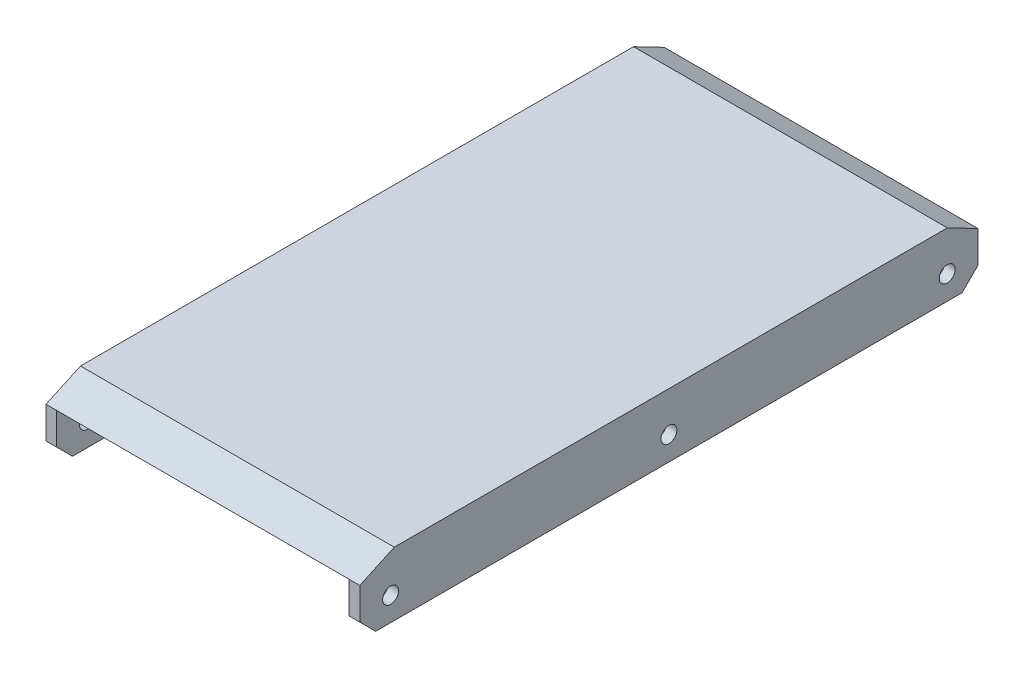
ISO-10303-21;
HEADER;
FILE_DESCRIPTION(('STEP AP214'),'2;1');
FILE_NAME('part.step','',(''),(''),'','','');
FILE_SCHEMA(('AUTOMOTIVE_DESIGN { 1 0 10303 214 1 1 1 1 }'));
ENDSEC;
DATA;
#1=APPLICATION_CONTEXT('core data for automotive mechanical design processes');
#2=APPLICATION_PROTOCOL_DEFINITION('international standard','automotive_design',2000,#1);
#3=PRODUCT_CONTEXT('',#1,'mechanical');
#4=PRODUCT('Part','Part','',(#3));
#5=PRODUCT_RELATED_PRODUCT_CATEGORY('part','',(#4));
#6=PRODUCT_DEFINITION_FORMATION('','',#4);
#7=PRODUCT_DEFINITION_CONTEXT('part definition',#1,'design');
#8=PRODUCT_DEFINITION('design','',#6,#7);
#9=PRODUCT_DEFINITION_SHAPE('','',#8);
#10=(LENGTH_UNIT() NAMED_UNIT(*) SI_UNIT(.MILLI.,.METRE.));
#11=(NAMED_UNIT(*) PLANE_ANGLE_UNIT() SI_UNIT($,.RADIAN.));
#12=(NAMED_UNIT(*) SI_UNIT($,.STERADIAN.) SOLID_ANGLE_UNIT());
#13=UNCERTAINTY_MEASURE_WITH_UNIT(LENGTH_MEASURE(1.E-05),#10,'distance_accuracy_value','');
#14=(GEOMETRIC_REPRESENTATION_CONTEXT(3) GLOBAL_UNCERTAINTY_ASSIGNED_CONTEXT((#13)) GLOBAL_UNIT_ASSIGNED_CONTEXT((#10,
#11,#12)) REPRESENTATION_CONTEXT('',''));
#15=CARTESIAN_POINT('',(0.,0.,0.));
#16=DIRECTION('',(0.,0.,1.));
#17=DIRECTION('',(1.,0.,0.));
#18=AXIS2_PLACEMENT_3D('',#15,#16,#17);
#19=CARTESIAN_POINT('',(175.858580481677,0.,0.));
#20=DIRECTION('',(0.,-1.,0.));
#21=DIRECTION('',(0.,0.,-1.));
#22=AXIS2_PLACEMENT_3D('',#19,#20,#21);
#23=PLANE('',#22);
#24=DIRECTION('',(-1.,0.,0.));
#25=VECTOR('',#24,1.);
#26=CARTESIAN_POINT('',(175.858580481677,0.,-58.31));
#27=LINE('',#26,#25);
#28=CARTESIAN_POINT('',(57.2,0.,-58.31));
#29=VERTEX_POINT('',#28);
#30=CARTESIAN_POINT('',(2.,0.,-58.31));
#31=VERTEX_POINT('',#30);
#32=EDGE_CURVE('E268',#29,#31,#27,.T.);
#33=ORIENTED_EDGE('',*,*,#32,.F.);
#34=DIRECTION('',(0.,0.,1.));
#35=VECTOR('',#34,1.);
#36=CARTESIAN_POINT('',(57.2,0.,-58.31));
#37=LINE('',#36,#35);
#38=CARTESIAN_POINT('',(57.2,0.,58.31));
#39=VERTEX_POINT('',#38);
#40=EDGE_CURVE('E61',#29,#39,#37,.T.);
#41=ORIENTED_EDGE('',*,*,#40,.T.);
#42=DIRECTION('',(-1.,0.,0.));
#43=VECTOR('',#42,1.);
#44=CARTESIAN_POINT('',(175.858580481677,0.,58.31));
#45=LINE('',#44,#43);
#46=CARTESIAN_POINT('',(2.,0.,58.31));
#47=VERTEX_POINT('',#46);
#48=EDGE_CURVE('E176',#39,#47,#45,.T.);
#49=ORIENTED_EDGE('',*,*,#48,.T.);
#50=DIRECTION('',(0.,0.,-1.));
#51=VECTOR('',#50,1.);
#52=CARTESIAN_POINT('',(2.,0.,0.));
#53=LINE('',#52,#51);
#54=EDGE_CURVE('E203',#47,#31,#53,.T.);
#55=ORIENTED_EDGE('',*,*,#54,.T.);
#56=EDGE_LOOP('',(#33,#41,#49,#55));
#57=FACE_BOUND('',#56,.T.);
#58=ADVANCED_FACE('F45',(#57),#23,.T.);
#59=CARTESIAN_POINT('',(2.,0.,-58.31));
#60=DIRECTION('',(0.,0.,-1.));
#61=DIRECTION('',(-1.,0.,0.));
#62=AXIS2_PLACEMENT_3D('',#59,#60,#61);
#63=PLANE('',#62);
#64=DIRECTION('',(0.,-1.,0.));
#65=VECTOR('',#64,1.);
#66=CARTESIAN_POINT('',(2.,0.,-58.31));
#67=LINE('',#66,#65);
#68=CARTESIAN_POINT('',(2.,-6.,-58.31));
#69=VERTEX_POINT('',#68);
#70=EDGE_CURVE('E201',#31,#69,#67,.T.);
#71=ORIENTED_EDGE('',*,*,#70,.T.);
#72=DIRECTION('',(-1.,0.,0.));
#73=VECTOR('',#72,1.);
#74=CARTESIAN_POINT('',(0.,-6.,-58.31));
#75=LINE('',#74,#73);
#76=CARTESIAN_POINT('',(0.,-6.,-58.31));
#77=VERTEX_POINT('',#76);
#78=EDGE_CURVE('E11',#69,#77,#75,.T.);
#79=ORIENTED_EDGE('',*,*,#78,.T.);
#80=DIRECTION('',(0.,-1.,0.));
#81=VECTOR('',#80,1.);
#82=CARTESIAN_POINT('',(0.,0.,-58.31));
#83=LINE('',#82,#81);
#84=CARTESIAN_POINT('',(0.,0.,-58.31));
#85=VERTEX_POINT('',#84);
#86=EDGE_CURVE('E198',#85,#77,#83,.T.);
#87=ORIENTED_EDGE('',*,*,#86,.F.);
#88=DIRECTION('',(-1.,0.,0.));
#89=VECTOR('',#88,1.);
#90=CARTESIAN_POINT('',(2.,0.,-58.31));
#91=LINE('',#90,#89);
#92=EDGE_CURVE('E221',#31,#85,#91,.T.);
#93=ORIENTED_EDGE('',*,*,#92,.F.);
#94=EDGE_LOOP('',(#71,#79,#87,#93));
#95=FACE_BOUND('',#94,.T.);
#96=ADVANCED_FACE('F339',(#95),#63,.T.);
#97=CARTESIAN_POINT('',(2.,0.,58.31));
#98=DIRECTION('',(0.,0.,-1.));
#99=DIRECTION('',(-1.,0.,0.));
#100=AXIS2_PLACEMENT_3D('',#97,#98,#99);
#101=PLANE('',#100);
#102=DIRECTION('',(0.,-1.,0.));
#103=VECTOR('',#102,1.);
#104=CARTESIAN_POINT('',(0.,0.,58.31));
#105=LINE('',#104,#103);
#106=CARTESIAN_POINT('',(0.,0.,58.31));
#107=VERTEX_POINT('',#106);
#108=CARTESIAN_POINT('',(0.,-6.00000000000001,58.31));
#109=VERTEX_POINT('',#108);
#110=EDGE_CURVE('E215',#107,#109,#105,.T.);
#111=ORIENTED_EDGE('',*,*,#110,.T.);
#112=DIRECTION('',(1.,0.,0.));
#113=VECTOR('',#112,1.);
#114=CARTESIAN_POINT('',(2.,-6.00000000000001,58.31));
#115=LINE('',#114,#113);
#116=CARTESIAN_POINT('',(2.,-6.00000000000001,58.31));
#117=VERTEX_POINT('',#116);
#118=EDGE_CURVE('E233',#109,#117,#115,.T.);
#119=ORIENTED_EDGE('',*,*,#118,.T.);
#120=DIRECTION('',(0.,-1.,0.));
#121=VECTOR('',#120,1.);
#122=CARTESIAN_POINT('',(2.,0.,58.31));
#123=LINE('',#122,#121);
#124=EDGE_CURVE('E207',#47,#117,#123,.T.);
#125=ORIENTED_EDGE('',*,*,#124,.F.);
#126=DIRECTION('',(-1.,0.,0.));
#127=VECTOR('',#126,1.);
#128=CARTESIAN_POINT('',(2.,0.,58.31));
#129=LINE('',#128,#127);
#130=EDGE_CURVE('E212',#47,#107,#129,.T.);
#131=ORIENTED_EDGE('',*,*,#130,.T.);
#132=EDGE_LOOP('',(#111,#119,#125,#131));
#133=FACE_BOUND('',#132,.T.);
#134=ADVANCED_FACE('F254',(#133),#101,.F.);
#135=CARTESIAN_POINT('',(2.,-9.,0.));
#136=DIRECTION('',(0.,1.,0.));
#137=DIRECTION('',(0.,0.,1.));
#138=AXIS2_PLACEMENT_3D('',#135,#136,#137);
#139=PLANE('',#138);
#140=DIRECTION('',(0.,0.,-1.));
#141=VECTOR('',#140,1.);
#142=CARTESIAN_POINT('',(2.,-9.,0.));
#143=LINE('',#142,#141);
#144=CARTESIAN_POINT('',(2.,-9.,55.31));
#145=VERTEX_POINT('',#144);
#146=CARTESIAN_POINT('',(2.,-9.,-55.31));
#147=VERTEX_POINT('',#146);
#148=EDGE_CURVE('E210',#145,#147,#143,.T.);
#149=ORIENTED_EDGE('',*,*,#148,.F.);
#150=DIRECTION('',(-1.,0.,0.));
#151=VECTOR('',#150,1.);
#152=CARTESIAN_POINT('',(2.,-9.,55.31));
#153=LINE('',#152,#151);
#154=CARTESIAN_POINT('',(0.,-9.,55.31));
#155=VERTEX_POINT('',#154);
#156=EDGE_CURVE('E226',#145,#155,#153,.T.);
#157=ORIENTED_EDGE('',*,*,#156,.T.);
#158=DIRECTION('',(0.,0.,-1.));
#159=VECTOR('',#158,1.);
#160=CARTESIAN_POINT('',(0.,-9.,0.));
#161=LINE('',#160,#159);
#162=CARTESIAN_POINT('',(0.,-9.,-55.31));
#163=VERTEX_POINT('',#162);
#164=EDGE_CURVE('E204',#155,#163,#161,.T.);
#165=ORIENTED_EDGE('',*,*,#164,.T.);
#166=DIRECTION('',(1.,0.,0.));
#167=VECTOR('',#166,1.);
#168=CARTESIAN_POINT('',(2.,-9.,-55.31));
#169=LINE('',#168,#167);
#170=EDGE_CURVE('E224',#163,#147,#169,.T.);
#171=ORIENTED_EDGE('',*,*,#170,.T.);
#172=EDGE_LOOP('',(#149,#157,#165,#171));
#173=FACE_BOUND('',#172,.T.);
#174=ADVANCED_FACE('F244',(#173),#139,.F.);
#175=CARTESIAN_POINT('',(2.,0.,0.));
#176=DIRECTION('',(1.,0.,0.));
#177=DIRECTION('',(0.,0.,-1.));
#178=AXIS2_PLACEMENT_3D('',#175,#176,#177);
#179=PLANE('',#178);
#180=CARTESIAN_POINT('',(2.,-4.5,-52.5));
#181=DIRECTION('',(-1.,0.,0.));
#182=DIRECTION('',(0.,0.,1.));
#183=AXIS2_PLACEMENT_3D('',#180,#181,#182);
#184=CIRCLE('',#183,1.5);
#185=CARTESIAN_POINT('',(2.,-4.5,-51.));
#186=VERTEX_POINT('',#185);
#187=EDGE_CURVE('E177',#186,#186,#184,.T.);
#188=ORIENTED_EDGE('',*,*,#187,.T.);
#189=EDGE_LOOP('',(#188));
#190=FACE_BOUND('',#189,.T.);
#191=CARTESIAN_POINT('',(2.,-4.49999999999999,52.5));
#192=DIRECTION('',(-1.,0.,0.));
#193=DIRECTION('',(0.,0.,1.));
#194=AXIS2_PLACEMENT_3D('',#191,#192,#193);
#195=CIRCLE('',#194,1.5);
#196=CARTESIAN_POINT('',(2.,-4.49999999999999,54.));
#197=VERTEX_POINT('',#196);
#198=EDGE_CURVE('E190',#197,#197,#195,.T.);
#199=ORIENTED_EDGE('',*,*,#198,.T.);
#200=EDGE_LOOP('',(#199));
#201=FACE_BOUND('',#200,.T.);
#202=CARTESIAN_POINT('',(2.,-4.5,0.));
#203=DIRECTION('',(-1.,0.,0.));
#204=DIRECTION('',(0.,0.,1.));
#205=AXIS2_PLACEMENT_3D('',#202,#203,#204);
#206=CIRCLE('',#205,1.5);
#207=CARTESIAN_POINT('',(2.,-4.5,1.5));
#208=VERTEX_POINT('',#207);
#209=EDGE_CURVE('E195',#208,#208,#206,.T.);
#210=ORIENTED_EDGE('',*,*,#209,.T.);
#211=EDGE_LOOP('',(#210));
#212=FACE_BOUND('',#211,.T.);
#213=ORIENTED_EDGE('',*,*,#124,.T.);
#214=DIRECTION('',(0.,0.707106781186549,0.707106781186546));
#215=VECTOR('',#214,1.);
#216=CARTESIAN_POINT('',(2.,-32.155,32.1550000000001));
#217=LINE('',#216,#215);
#218=EDGE_CURVE('E54',#117,#145,#217,.F.);
#219=ORIENTED_EDGE('',*,*,#218,.T.);
#220=ORIENTED_EDGE('',*,*,#148,.T.);
#221=DIRECTION('',(0.,0.707106781186548,-0.707106781186548));
#222=VECTOR('',#221,1.);
#223=CARTESIAN_POINT('',(2.,-32.155,-32.155));
#224=LINE('',#223,#222);
#225=EDGE_CURVE('E69',#147,#69,#224,.T.);
#226=ORIENTED_EDGE('',*,*,#225,.T.);
#227=ORIENTED_EDGE('',*,*,#70,.F.);
#228=ORIENTED_EDGE('',*,*,#54,.F.);
#229=EDGE_LOOP('',(#213,#219,#220,#226,#227,#228));
#230=FACE_BOUND('',#229,.T.);
#231=ADVANCED_FACE('F237',(#190,#201,#212,#230),#179,.T.);
#232=CARTESIAN_POINT('',(0.,0.,0.));
#233=DIRECTION('',(1.,0.,0.));
#234=DIRECTION('',(0.,0.,-1.));
#235=AXIS2_PLACEMENT_3D('',#232,#233,#234);
#236=PLANE('',#235);
#237=CARTESIAN_POINT('',(0.,-4.5,-52.5));
#238=DIRECTION('',(-1.,0.,0.));
#239=DIRECTION('',(0.,0.,1.));
#240=AXIS2_PLACEMENT_3D('',#237,#238,#239);
#241=CIRCLE('',#240,1.5);
#242=CARTESIAN_POINT('',(0.,-4.5,-51.));
#243=VERTEX_POINT('',#242);
#244=EDGE_CURVE('E180',#243,#243,#241,.T.);
#245=ORIENTED_EDGE('',*,*,#244,.F.);
#246=EDGE_LOOP('',(#245));
#247=FACE_BOUND('',#246,.T.);
#248=CARTESIAN_POINT('',(0.,-4.49999999999999,52.5));
#249=DIRECTION('',(-1.,0.,0.));
#250=DIRECTION('',(0.,0.,1.));
#251=AXIS2_PLACEMENT_3D('',#248,#249,#250);
#252=CIRCLE('',#251,1.5);
#253=CARTESIAN_POINT('',(0.,-4.49999999999999,54.));
#254=VERTEX_POINT('',#253);
#255=EDGE_CURVE('E186',#254,#254,#252,.T.);
#256=ORIENTED_EDGE('',*,*,#255,.F.);
#257=EDGE_LOOP('',(#256));
#258=FACE_BOUND('',#257,.T.);
#259=CARTESIAN_POINT('',(0.,-4.5,0.));
#260=DIRECTION('',(-1.,0.,0.));
#261=DIRECTION('',(0.,0.,1.));
#262=AXIS2_PLACEMENT_3D('',#259,#260,#261);
#263=CIRCLE('',#262,1.5);
#264=CARTESIAN_POINT('',(0.,-4.5,1.5));
#265=VERTEX_POINT('',#264);
#266=EDGE_CURVE('E189',#265,#265,#263,.T.);
#267=ORIENTED_EDGE('',*,*,#266,.F.);
#268=EDGE_LOOP('',(#267));
#269=FACE_BOUND('',#268,.T.);
#270=ORIENTED_EDGE('',*,*,#164,.F.);
#271=DIRECTION('',(0.,-0.707106781186549,-0.707106781186546));
#272=VECTOR('',#271,1.);
#273=CARTESIAN_POINT('',(0.,-9.,55.31));
#274=LINE('',#273,#272);
#275=EDGE_CURVE('E231',#155,#109,#274,.F.);
#276=ORIENTED_EDGE('',*,*,#275,.T.);
#277=ORIENTED_EDGE('',*,*,#110,.F.);
#278=DIRECTION('',(0.,0.419146691120855,-0.907918526808677));
#279=VECTOR('',#278,1.);
#280=CARTESIAN_POINT('',(0.,22.1899315108713,10.2441310473886));
#281=LINE('',#280,#279);
#282=CARTESIAN_POINT('',(0.,3.,51.8116650778219));
#283=VERTEX_POINT('',#282);
#284=EDGE_CURVE('E255',#107,#283,#281,.T.);
#285=ORIENTED_EDGE('',*,*,#284,.T.);
#286=DIRECTION('',(0.,0.,-1.));
#287=VECTOR('',#286,1.);
#288=CARTESIAN_POINT('',(0.,3.,0.));
#289=LINE('',#288,#287);
#290=CARTESIAN_POINT('',(0.,3.,-52.5256517674229));
#291=VERTEX_POINT('',#290);
#292=EDGE_CURVE('E258',#283,#291,#289,.T.);
#293=ORIENTED_EDGE('',*,*,#292,.T.);
#294=DIRECTION('',(0.,-0.460402833421412,-0.887710105258206));
#295=VECTOR('',#294,1.);
#296=CARTESIAN_POINT('',(0.,23.831544684419,-12.3600155416999));
#297=LINE('',#296,#295);
#298=EDGE_CURVE('E171',#291,#85,#297,.T.);
#299=ORIENTED_EDGE('',*,*,#298,.T.);
#300=ORIENTED_EDGE('',*,*,#86,.T.);
#301=DIRECTION('',(0.,-0.707106781186548,0.707106781186548));
#302=VECTOR('',#301,1.);
#303=CARTESIAN_POINT('',(0.,-6.,-58.31));
#304=LINE('',#303,#302);
#305=EDGE_CURVE('E229',#77,#163,#304,.T.);
#306=ORIENTED_EDGE('',*,*,#305,.T.);
#307=EDGE_LOOP('',(#270,#276,#277,#285,#293,#299,#300,#306));
#308=FACE_BOUND('',#307,.T.);
#309=ADVANCED_FACE('F250',(#247,#258,#269,#308),#236,.F.);
#310=CARTESIAN_POINT('',(2.,-4.5,0.));
#311=DIRECTION('',(-1.,0.,0.));
#312=DIRECTION('',(0.,0.,1.));
#313=AXIS2_PLACEMENT_3D('',#310,#311,#312);
#314=CYLINDRICAL_SURFACE('',#313,1.5);
#315=ORIENTED_EDGE('',*,*,#209,.F.);
#316=EDGE_LOOP('',(#315));
#317=FACE_BOUND('',#316,.T.);
#318=ORIENTED_EDGE('',*,*,#266,.T.);
#319=EDGE_LOOP('',(#318));
#320=FACE_BOUND('',#319,.T.);
#321=ADVANCED_FACE('F455',(#317,#320),#314,.F.);
#322=CARTESIAN_POINT('',(2.,-4.49999999999999,52.5));
#323=DIRECTION('',(-1.,0.,0.));
#324=DIRECTION('',(0.,0.,1.));
#325=AXIS2_PLACEMENT_3D('',#322,#323,#324);
#326=CYLINDRICAL_SURFACE('',#325,1.5);
#327=ORIENTED_EDGE('',*,*,#198,.F.);
#328=EDGE_LOOP('',(#327));
#329=FACE_BOUND('',#328,.T.);
#330=ORIENTED_EDGE('',*,*,#255,.T.);
#331=EDGE_LOOP('',(#330));
#332=FACE_BOUND('',#331,.T.);
#333=ADVANCED_FACE('F504',(#329,#332),#326,.F.);
#334=CARTESIAN_POINT('',(2.,-4.5,-52.5));
#335=DIRECTION('',(-1.,0.,0.));
#336=DIRECTION('',(0.,0.,1.));
#337=AXIS2_PLACEMENT_3D('',#334,#335,#336);
#338=CYLINDRICAL_SURFACE('',#337,1.5);
#339=ORIENTED_EDGE('',*,*,#187,.F.);
#340=EDGE_LOOP('',(#339));
#341=FACE_BOUND('',#340,.T.);
#342=ORIENTED_EDGE('',*,*,#244,.T.);
#343=EDGE_LOOP('',(#342));
#344=FACE_BOUND('',#343,.T.);
#345=ADVANCED_FACE('F513',(#341,#344),#338,.F.);
#346=CARTESIAN_POINT('',(2.,-9.,55.31));
#347=DIRECTION('',(0.,0.707106781186546,-0.707106781186549));
#348=DIRECTION('',(-1.,0.,0.));
#349=AXIS2_PLACEMENT_3D('',#346,#347,#348);
#350=PLANE('',#349);
#351=ORIENTED_EDGE('',*,*,#218,.F.);
#352=ORIENTED_EDGE('',*,*,#118,.F.);
#353=ORIENTED_EDGE('',*,*,#275,.F.);
#354=ORIENTED_EDGE('',*,*,#156,.F.);
#355=EDGE_LOOP('',(#351,#352,#353,#354));
#356=FACE_BOUND('',#355,.T.);
#357=ADVANCED_FACE('F247',(#356),#350,.F.);
#358=CARTESIAN_POINT('',(2.,-6.,-58.31));
#359=DIRECTION('',(0.,-0.707106781186547,-0.707106781186547));
#360=DIRECTION('',(1.,0.,0.));
#361=AXIS2_PLACEMENT_3D('',#358,#359,#360);
#362=PLANE('',#361);
#363=ORIENTED_EDGE('',*,*,#225,.F.);
#364=ORIENTED_EDGE('',*,*,#170,.F.);
#365=ORIENTED_EDGE('',*,*,#305,.F.);
#366=ORIENTED_EDGE('',*,*,#78,.F.);
#367=EDGE_LOOP('',(#363,#364,#365,#366));
#368=FACE_BOUND('',#367,.T.);
#369=ADVANCED_FACE('F48',(#368),#362,.T.);
#370=CARTESIAN_POINT('',(59.2,0.,0.));
#371=DIRECTION('',(1.,0.,0.));
#372=DIRECTION('',(0.,0.,-1.));
#373=AXIS2_PLACEMENT_3D('',#370,#371,#372);
#374=PLANE('',#373);
#375=DIRECTION('',(0.,0.419146691120855,-0.907918526808677));
#376=VECTOR('',#375,1.);
#377=CARTESIAN_POINT('',(59.2,22.1899315108713,10.2441310473886));
#378=LINE('',#377,#376);
#379=CARTESIAN_POINT('',(59.2,0.,58.31));
#380=VERTEX_POINT('',#379);
#381=CARTESIAN_POINT('',(59.2,3.,51.8116650778219));
#382=VERTEX_POINT('',#381);
#383=EDGE_CURVE('E163',#380,#382,#378,.T.);
#384=ORIENTED_EDGE('',*,*,#383,.F.);
#385=DIRECTION('',(0.,-1.,0.));
#386=VECTOR('',#385,1.);
#387=CARTESIAN_POINT('',(59.2,0.,58.31));
#388=LINE('',#387,#386);
#389=CARTESIAN_POINT('',(59.2,-6.00000000000001,58.31));
#390=VERTEX_POINT('',#389);
#391=EDGE_CURVE('E150',#380,#390,#388,.T.);
#392=ORIENTED_EDGE('',*,*,#391,.T.);
#393=DIRECTION('',(0.,-0.707106781186549,-0.707106781186546));
#394=VECTOR('',#393,1.);
#395=CARTESIAN_POINT('',(59.2,-6.00000000000001,58.31));
#396=LINE('',#395,#394);
#397=CARTESIAN_POINT('',(59.2,-9.,55.31));
#398=VERTEX_POINT('',#397);
#399=EDGE_CURVE('E159',#390,#398,#396,.T.);
#400=ORIENTED_EDGE('',*,*,#399,.T.);
#401=DIRECTION('',(0.,0.,-1.));
#402=VECTOR('',#401,1.);
#403=CARTESIAN_POINT('',(59.2,-9.,55.31));
#404=LINE('',#403,#402);
#405=CARTESIAN_POINT('',(59.2,-9.,-55.31));
#406=VERTEX_POINT('',#405);
#407=EDGE_CURVE('E304',#398,#406,#404,.T.);
#408=ORIENTED_EDGE('',*,*,#407,.T.);
#409=DIRECTION('',(0.,0.707106781186547,-0.707106781186547));
#410=VECTOR('',#409,1.);
#411=CARTESIAN_POINT('',(59.2,-9.,-55.31));
#412=LINE('',#411,#410);
#413=CARTESIAN_POINT('',(59.2,-6.,-58.31));
#414=VERTEX_POINT('',#413);
#415=EDGE_CURVE('E302',#406,#414,#412,.T.);
#416=ORIENTED_EDGE('',*,*,#415,.T.);
#417=DIRECTION('',(0.,1.,0.));
#418=VECTOR('',#417,1.);
#419=CARTESIAN_POINT('',(59.2,-6.,-58.31));
#420=LINE('',#419,#418);
#421=CARTESIAN_POINT('',(59.2,0.,-58.31));
#422=VERTEX_POINT('',#421);
#423=EDGE_CURVE('E289',#414,#422,#420,.T.);
#424=ORIENTED_EDGE('',*,*,#423,.T.);
#425=DIRECTION('',(0.,-0.460402833421412,-0.887710105258206));
#426=VECTOR('',#425,1.);
#427=CARTESIAN_POINT('',(59.2,23.831544684419,-12.3600155416999));
#428=LINE('',#427,#426);
#429=CARTESIAN_POINT('',(59.2,3.,-52.5256517674229));
#430=VERTEX_POINT('',#429);
#431=EDGE_CURVE('E265',#430,#422,#428,.T.);
#432=ORIENTED_EDGE('',*,*,#431,.F.);
#433=DIRECTION('',(0.,0.,-1.));
#434=VECTOR('',#433,1.);
#435=CARTESIAN_POINT('',(59.2,3.,0.));
#436=LINE('',#435,#434);
#437=EDGE_CURVE('E167',#382,#430,#436,.T.);
#438=ORIENTED_EDGE('',*,*,#437,.F.);
#439=EDGE_LOOP('',(#384,#392,#400,#408,#416,#424,#432,#438));
#440=FACE_BOUND('',#439,.T.);
#441=CARTESIAN_POINT('',(59.2,-4.49999999999999,52.5));
#442=DIRECTION('',(1.,0.,0.));
#443=DIRECTION('',(0.,0.,-1.));
#444=AXIS2_PLACEMENT_3D('',#441,#442,#443);
#445=CIRCLE('',#444,1.5);
#446=CARTESIAN_POINT('',(59.2,-4.49999999999999,51.));
#447=VERTEX_POINT('',#446);
#448=EDGE_CURVE('E310',#447,#447,#445,.T.);
#449=ORIENTED_EDGE('',*,*,#448,.F.);
#450=EDGE_LOOP('',(#449));
#451=FACE_BOUND('',#450,.T.);
#452=CARTESIAN_POINT('',(59.2,-4.5,0.));
#453=DIRECTION('',(1.,0.,0.));
#454=DIRECTION('',(0.,0.,-1.));
#455=AXIS2_PLACEMENT_3D('',#452,#453,#454);
#456=CIRCLE('',#455,1.5);
#457=CARTESIAN_POINT('',(59.2,-4.5,-1.5));
#458=VERTEX_POINT('',#457);
#459=EDGE_CURVE('E300',#458,#458,#456,.T.);
#460=ORIENTED_EDGE('',*,*,#459,.F.);
#461=EDGE_LOOP('',(#460));
#462=FACE_BOUND('',#461,.T.);
#463=CARTESIAN_POINT('',(59.2,-4.5,-52.5));
#464=DIRECTION('',(1.,0.,0.));
#465=DIRECTION('',(0.,0.,-1.));
#466=AXIS2_PLACEMENT_3D('',#463,#464,#465);
#467=CIRCLE('',#466,1.5);
#468=CARTESIAN_POINT('',(59.2,-4.5,-54.));
#469=VERTEX_POINT('',#468);
#470=EDGE_CURVE('E316',#469,#469,#467,.T.);
#471=ORIENTED_EDGE('',*,*,#470,.F.);
#472=EDGE_LOOP('',(#471));
#473=FACE_BOUND('',#472,.T.);
#474=ADVANCED_FACE('F164',(#440,#451,#462,#473),#374,.T.);
#475=CARTESIAN_POINT('',(175.858580481677,22.1899315108713,10.2441310473886));
#476=DIRECTION('',(0.,0.907918526808677,0.419146691120855));
#477=DIRECTION('',(0.,-0.419146691120855,0.907918526808677));
#478=AXIS2_PLACEMENT_3D('',#475,#476,#477);
#479=PLANE('',#478);
#480=EDGE_CURVE('E154',#380,#39,#45,.T.);
#481=ORIENTED_EDGE('',*,*,#480,.F.);
#482=ORIENTED_EDGE('',*,*,#383,.T.);
#483=DIRECTION('',(-1.,0.,0.));
#484=VECTOR('',#483,1.);
#485=CARTESIAN_POINT('',(175.858580481677,3.,51.8116650778219));
#486=LINE('',#485,#484);
#487=EDGE_CURVE('E170',#382,#283,#486,.T.);
#488=ORIENTED_EDGE('',*,*,#487,.T.);
#489=ORIENTED_EDGE('',*,*,#284,.F.);
#490=ORIENTED_EDGE('',*,*,#130,.F.);
#491=ORIENTED_EDGE('',*,*,#48,.F.);
#492=EDGE_LOOP('',(#481,#482,#488,#489,#490,#491));
#493=FACE_BOUND('',#492,.T.);
#494=ADVANCED_FACE('F174',(#493),#479,.T.);
#495=CARTESIAN_POINT('',(175.858580481677,3.,0.));
#496=DIRECTION('',(0.,1.,0.));
#497=DIRECTION('',(0.,0.,1.));
#498=AXIS2_PLACEMENT_3D('',#495,#496,#497);
#499=PLANE('',#498);
#500=ORIENTED_EDGE('',*,*,#487,.F.);
#501=ORIENTED_EDGE('',*,*,#437,.T.);
#502=DIRECTION('',(-1.,0.,0.));
#503=VECTOR('',#502,1.);
#504=CARTESIAN_POINT('',(175.858580481677,3.,-52.5256517674229));
#505=LINE('',#504,#503);
#506=EDGE_CURVE('E269',#430,#291,#505,.T.);
#507=ORIENTED_EDGE('',*,*,#506,.T.);
#508=ORIENTED_EDGE('',*,*,#292,.F.);
#509=EDGE_LOOP('',(#500,#501,#507,#508));
#510=FACE_BOUND('',#509,.T.);
#511=ADVANCED_FACE('F274',(#510),#499,.T.);
#512=CARTESIAN_POINT('',(175.858580481677,23.831544684419,-12.3600155416999));
#513=DIRECTION('',(0.,0.887710105258206,-0.460402833421412));
#514=DIRECTION('',(0.,0.460402833421412,0.887710105258206));
#515=AXIS2_PLACEMENT_3D('',#512,#513,#514);
#516=PLANE('',#515);
#517=ORIENTED_EDGE('',*,*,#506,.F.);
#518=ORIENTED_EDGE('',*,*,#431,.T.);
#519=EDGE_CURVE('E182',#422,#29,#27,.T.);
#520=ORIENTED_EDGE('',*,*,#519,.T.);
#521=ORIENTED_EDGE('',*,*,#32,.T.);
#522=ORIENTED_EDGE('',*,*,#92,.T.);
#523=ORIENTED_EDGE('',*,*,#298,.F.);
#524=EDGE_LOOP('',(#517,#518,#520,#521,#522,#523));
#525=FACE_BOUND('',#524,.T.);
#526=ADVANCED_FACE('F278',(#525),#516,.T.);
#527=CARTESIAN_POINT('',(57.2,0.,0.));
#528=DIRECTION('',(1.,0.,0.));
#529=DIRECTION('',(0.,0.,-1.));
#530=AXIS2_PLACEMENT_3D('',#527,#528,#529);
#531=PLANE('',#530);
#532=ORIENTED_EDGE('',*,*,#40,.F.);
#533=DIRECTION('',(0.,1.,0.));
#534=VECTOR('',#533,1.);
#535=CARTESIAN_POINT('',(57.2,-6.,-58.31));
#536=LINE('',#535,#534);
#537=CARTESIAN_POINT('',(57.2,-6.,-58.31));
#538=VERTEX_POINT('',#537);
#539=EDGE_CURVE('E160',#538,#29,#536,.T.);
#540=ORIENTED_EDGE('',*,*,#539,.F.);
#541=DIRECTION('',(0.,0.707106781186547,-0.707106781186547));
#542=VECTOR('',#541,1.);
#543=CARTESIAN_POINT('',(57.2,-9.,-55.31));
#544=LINE('',#543,#542);
#545=CARTESIAN_POINT('',(57.2,-9.,-55.31));
#546=VERTEX_POINT('',#545);
#547=EDGE_CURVE('E291',#546,#538,#544,.T.);
#548=ORIENTED_EDGE('',*,*,#547,.F.);
#549=DIRECTION('',(0.,0.,-1.));
#550=VECTOR('',#549,1.);
#551=CARTESIAN_POINT('',(57.2,-9.,55.31));
#552=LINE('',#551,#550);
#553=CARTESIAN_POINT('',(57.2,-9.,55.31));
#554=VERTEX_POINT('',#553);
#555=EDGE_CURVE('E293',#554,#546,#552,.T.);
#556=ORIENTED_EDGE('',*,*,#555,.F.);
#557=DIRECTION('',(0.,-0.707106781186549,-0.707106781186546));
#558=VECTOR('',#557,1.);
#559=CARTESIAN_POINT('',(57.2,-6.00000000000001,58.31));
#560=LINE('',#559,#558);
#561=CARTESIAN_POINT('',(57.2,-6.00000000000001,58.31));
#562=VERTEX_POINT('',#561);
#563=EDGE_CURVE('E295',#562,#554,#560,.T.);
#564=ORIENTED_EDGE('',*,*,#563,.F.);
#565=DIRECTION('',(0.,-1.,0.));
#566=VECTOR('',#565,1.);
#567=CARTESIAN_POINT('',(57.2,0.,58.31));
#568=LINE('',#567,#566);
#569=EDGE_CURVE('E297',#39,#562,#568,.T.);
#570=ORIENTED_EDGE('',*,*,#569,.F.);
#571=EDGE_LOOP('',(#532,#540,#548,#556,#564,#570));
#572=FACE_BOUND('',#571,.T.);
#573=CARTESIAN_POINT('',(57.2,-4.5,0.));
#574=DIRECTION('',(1.,0.,0.));
#575=DIRECTION('',(0.,0.,-1.));
#576=AXIS2_PLACEMENT_3D('',#573,#574,#575);
#577=CIRCLE('',#576,1.5);
#578=CARTESIAN_POINT('',(57.2,-4.5,-1.5));
#579=VERTEX_POINT('',#578);
#580=EDGE_CURVE('E307',#579,#579,#577,.T.);
#581=ORIENTED_EDGE('',*,*,#580,.T.);
#582=EDGE_LOOP('',(#581));
#583=FACE_BOUND('',#582,.T.);
#584=CARTESIAN_POINT('',(57.2,-4.49999999999999,52.5));
#585=DIRECTION('',(1.,0.,0.));
#586=DIRECTION('',(0.,0.,-1.));
#587=AXIS2_PLACEMENT_3D('',#584,#585,#586);
#588=CIRCLE('',#587,1.5);
#589=CARTESIAN_POINT('',(57.2,-4.49999999999999,51.));
#590=VERTEX_POINT('',#589);
#591=EDGE_CURVE('E313',#590,#590,#588,.T.);
#592=ORIENTED_EDGE('',*,*,#591,.T.);
#593=EDGE_LOOP('',(#592));
#594=FACE_BOUND('',#593,.T.);
#595=CARTESIAN_POINT('',(57.2,-4.5,-52.5));
#596=DIRECTION('',(1.,0.,0.));
#597=DIRECTION('',(0.,0.,-1.));
#598=AXIS2_PLACEMENT_3D('',#595,#596,#597);
#599=CIRCLE('',#598,1.5);
#600=CARTESIAN_POINT('',(57.2,-4.5,-54.));
#601=VERTEX_POINT('',#600);
#602=EDGE_CURVE('E319',#601,#601,#599,.T.);
#603=ORIENTED_EDGE('',*,*,#602,.T.);
#604=EDGE_LOOP('',(#603));
#605=FACE_BOUND('',#604,.T.);
#606=ADVANCED_FACE('F353',(#572,#583,#594,#605),#531,.F.);
#607=CARTESIAN_POINT('',(59.2,0.,58.31));
#608=DIRECTION('',(0.,0.,-1.));
#609=DIRECTION('',(-1.,0.,0.));
#610=AXIS2_PLACEMENT_3D('',#607,#608,#609);
#611=PLANE('',#610);
#612=ORIENTED_EDGE('',*,*,#569,.T.);
#613=DIRECTION('',(-1.,0.,0.));
#614=VECTOR('',#613,1.);
#615=CARTESIAN_POINT('',(59.2,-6.00000000000001,58.31));
#616=LINE('',#615,#614);
#617=EDGE_CURVE('E156',#390,#562,#616,.T.);
#618=ORIENTED_EDGE('',*,*,#617,.F.);
#619=ORIENTED_EDGE('',*,*,#391,.F.);
#620=ORIENTED_EDGE('',*,*,#480,.T.);
#621=EDGE_LOOP('',(#612,#618,#619,#620));
#622=FACE_BOUND('',#621,.T.);
#623=ADVANCED_FACE('F152',(#622),#611,.F.);
#624=CARTESIAN_POINT('',(59.2,-6.00000000000001,58.31));
#625=DIRECTION('',(0.,0.707106781186546,-0.707106781186549));
#626=DIRECTION('',(0.,0.707106781186549,0.707106781186546));
#627=AXIS2_PLACEMENT_3D('',#624,#625,#626);
#628=PLANE('',#627);
#629=ORIENTED_EDGE('',*,*,#563,.T.);
#630=DIRECTION('',(-1.,0.,0.));
#631=VECTOR('',#630,1.);
#632=CARTESIAN_POINT('',(59.2,-9.,55.31));
#633=LINE('',#632,#631);
#634=EDGE_CURVE('E261',#398,#554,#633,.T.);
#635=ORIENTED_EDGE('',*,*,#634,.F.);
#636=ORIENTED_EDGE('',*,*,#399,.F.);
#637=ORIENTED_EDGE('',*,*,#617,.T.);
#638=EDGE_LOOP('',(#629,#635,#636,#637));
#639=FACE_BOUND('',#638,.T.);
#640=ADVANCED_FACE('F378',(#639),#628,.F.);
#641=CARTESIAN_POINT('',(59.2,-9.,55.31));
#642=DIRECTION('',(0.,1.,0.));
#643=DIRECTION('',(0.,0.,1.));
#644=AXIS2_PLACEMENT_3D('',#641,#642,#643);
#645=PLANE('',#644);
#646=ORIENTED_EDGE('',*,*,#555,.T.);
#647=DIRECTION('',(-1.,0.,0.));
#648=VECTOR('',#647,1.);
#649=CARTESIAN_POINT('',(59.2,-9.,-55.31));
#650=LINE('',#649,#648);
#651=EDGE_CURVE('E283',#406,#546,#650,.T.);
#652=ORIENTED_EDGE('',*,*,#651,.F.);
#653=ORIENTED_EDGE('',*,*,#407,.F.);
#654=ORIENTED_EDGE('',*,*,#634,.T.);
#655=EDGE_LOOP('',(#646,#652,#653,#654));
#656=FACE_BOUND('',#655,.T.);
#657=ADVANCED_FACE('F384',(#656),#645,.F.);
#658=CARTESIAN_POINT('',(59.2,-9.,-55.31));
#659=DIRECTION('',(0.,0.707106781186547,0.707106781186547));
#660=DIRECTION('',(0.,-0.707106781186548,0.707106781186548));
#661=AXIS2_PLACEMENT_3D('',#658,#659,#660);
#662=PLANE('',#661);
#663=ORIENTED_EDGE('',*,*,#547,.T.);
#664=DIRECTION('',(-1.,0.,0.));
#665=VECTOR('',#664,1.);
#666=CARTESIAN_POINT('',(59.2,-6.,-58.31));
#667=LINE('',#666,#665);
#668=EDGE_CURVE('E286',#414,#538,#667,.T.);
#669=ORIENTED_EDGE('',*,*,#668,.F.);
#670=ORIENTED_EDGE('',*,*,#415,.F.);
#671=ORIENTED_EDGE('',*,*,#651,.T.);
#672=EDGE_LOOP('',(#663,#669,#670,#671));
#673=FACE_BOUND('',#672,.T.);
#674=ADVANCED_FACE('F391',(#673),#662,.F.);
#675=CARTESIAN_POINT('',(59.2,-6.,-58.31));
#676=DIRECTION('',(0.,0.,1.));
#677=DIRECTION('',(1.,0.,0.));
#678=AXIS2_PLACEMENT_3D('',#675,#676,#677);
#679=PLANE('',#678);
#680=ORIENTED_EDGE('',*,*,#539,.T.);
#681=ORIENTED_EDGE('',*,*,#519,.F.);
#682=ORIENTED_EDGE('',*,*,#423,.F.);
#683=ORIENTED_EDGE('',*,*,#668,.T.);
#684=EDGE_LOOP('',(#680,#681,#682,#683));
#685=FACE_BOUND('',#684,.T.);
#686=ADVANCED_FACE('F399',(#685),#679,.F.);
#687=CARTESIAN_POINT('',(59.2,-4.5,0.));
#688=DIRECTION('',(-1.,0.,0.));
#689=DIRECTION('',(0.,0.,1.));
#690=AXIS2_PLACEMENT_3D('',#687,#688,#689);
#691=CYLINDRICAL_SURFACE('',#690,1.5);
#692=ORIENTED_EDGE('',*,*,#459,.T.);
#693=EDGE_LOOP('',(#692));
#694=FACE_BOUND('',#693,.T.);
#695=ORIENTED_EDGE('',*,*,#580,.F.);
#696=EDGE_LOOP('',(#695));
#697=FACE_BOUND('',#696,.T.);
#698=ADVANCED_FACE('F407',(#694,#697),#691,.F.);
#699=CARTESIAN_POINT('',(59.2,-4.49999999999999,52.5));
#700=DIRECTION('',(-1.,0.,0.));
#701=DIRECTION('',(0.,0.,1.));
#702=AXIS2_PLACEMENT_3D('',#699,#700,#701);
#703=CYLINDRICAL_SURFACE('',#702,1.5);
#704=ORIENTED_EDGE('',*,*,#448,.T.);
#705=EDGE_LOOP('',(#704));
#706=FACE_BOUND('',#705,.T.);
#707=ORIENTED_EDGE('',*,*,#591,.F.);
#708=EDGE_LOOP('',(#707));
#709=FACE_BOUND('',#708,.T.);
#710=ADVANCED_FACE('F415',(#706,#709),#703,.F.);
#711=CARTESIAN_POINT('',(59.2,-4.5,-52.5));
#712=DIRECTION('',(-1.,0.,0.));
#713=DIRECTION('',(0.,0.,1.));
#714=AXIS2_PLACEMENT_3D('',#711,#712,#713);
#715=CYLINDRICAL_SURFACE('',#714,1.5);
#716=ORIENTED_EDGE('',*,*,#470,.T.);
#717=EDGE_LOOP('',(#716));
#718=FACE_BOUND('',#717,.T.);
#719=ORIENTED_EDGE('',*,*,#602,.F.);
#720=EDGE_LOOP('',(#719));
#721=FACE_BOUND('',#720,.T.);
#722=ADVANCED_FACE('F325',(#718,#721),#715,.F.);
#723=CLOSED_SHELL('',(#58,#96,#134,#174,#231,#309,#321,#333,#345,#357,#369,#474,#494,#511,#526,
#606,#623,#640,#657,#674,#686,#698,#710,#722));
#724=MANIFOLD_SOLID_BREP('B2',#723);
#725=ADVANCED_BREP_SHAPE_REPRESENTATION('',(#18,#724),#14);
#726=SHAPE_DEFINITION_REPRESENTATION(#9,#725);
ENDSEC;
END-ISO-10303-21;
